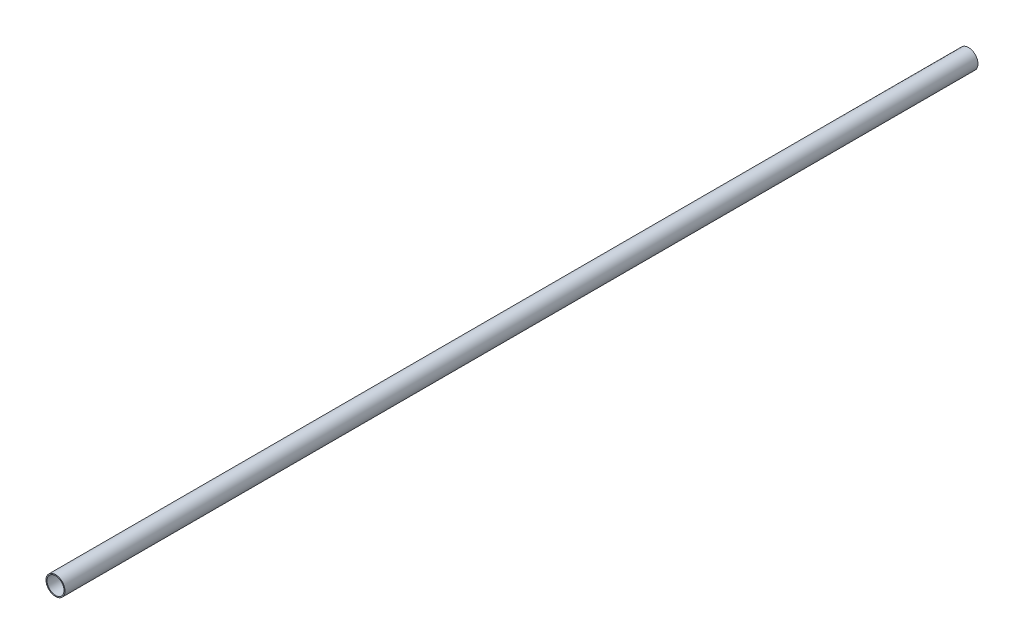
ISO-10303-21;
HEADER;
FILE_DESCRIPTION(('STEP AP214'),'2;1');
FILE_NAME('part.step','',(''),(''),'','','');
FILE_SCHEMA(('AUTOMOTIVE_DESIGN { 1 0 10303 214 1 1 1 1 }'));
ENDSEC;
DATA;
#1=APPLICATION_CONTEXT('core data for automotive mechanical design processes');
#2=APPLICATION_PROTOCOL_DEFINITION('international standard','automotive_design',2000,#1);
#3=PRODUCT_CONTEXT('',#1,'mechanical');
#4=PRODUCT('Part','Part','',(#3));
#5=PRODUCT_RELATED_PRODUCT_CATEGORY('part','',(#4));
#6=PRODUCT_DEFINITION_FORMATION('','',#4);
#7=PRODUCT_DEFINITION_CONTEXT('part definition',#1,'design');
#8=PRODUCT_DEFINITION('design','',#6,#7);
#9=PRODUCT_DEFINITION_SHAPE('','',#8);
#10=(LENGTH_UNIT() NAMED_UNIT(*) SI_UNIT(.MILLI.,.METRE.));
#11=(NAMED_UNIT(*) PLANE_ANGLE_UNIT() SI_UNIT($,.RADIAN.));
#12=(NAMED_UNIT(*) SI_UNIT($,.STERADIAN.) SOLID_ANGLE_UNIT());
#13=UNCERTAINTY_MEASURE_WITH_UNIT(LENGTH_MEASURE(1.E-05),#10,'distance_accuracy_value','');
#14=(GEOMETRIC_REPRESENTATION_CONTEXT(3) GLOBAL_UNCERTAINTY_ASSIGNED_CONTEXT((#13)) GLOBAL_UNIT_ASSIGNED_CONTEXT((#10,
#11,#12)) REPRESENTATION_CONTEXT('',''));
#15=CARTESIAN_POINT('',(0.,0.,0.));
#16=DIRECTION('',(0.,0.,1.));
#17=DIRECTION('',(1.,0.,0.));
#18=AXIS2_PLACEMENT_3D('',#15,#16,#17);
#19=CARTESIAN_POINT('',(0.,0.,5486.4));
#20=DIRECTION('',(0.,0.,1.));
#21=DIRECTION('',(1.,0.,0.));
#22=AXIS2_PLACEMENT_3D('',#19,#20,#21);
#23=PLANE('',#22);
#24=CARTESIAN_POINT('',(0.,0.,5486.4));
#25=DIRECTION('',(0.,0.,1.));
#26=DIRECTION('',(1.,0.,0.));
#27=AXIS2_PLACEMENT_3D('',#24,#25,#26);
#28=CIRCLE('',#27,57.15);
#29=CARTESIAN_POINT('',(57.15,0.,5486.4));
#30=VERTEX_POINT('',#29);
#31=EDGE_CURVE('E10',#30,#30,#28,.T.);
#32=ORIENTED_EDGE('',*,*,#31,.T.);
#33=EDGE_LOOP('',(#32));
#34=FACE_BOUND('',#33,.T.);
#35=CARTESIAN_POINT('',(0.,0.,5486.4));
#36=DIRECTION('',(0.,0.,1.));
#37=DIRECTION('',(1.,0.,0.));
#38=AXIS2_PLACEMENT_3D('',#35,#36,#37);
#39=CIRCLE('',#38,51.1302);
#40=CARTESIAN_POINT('',(51.1302,0.,5486.4));
#41=VERTEX_POINT('',#40);
#42=EDGE_CURVE('E47',#41,#41,#39,.T.);
#43=ORIENTED_EDGE('',*,*,#42,.F.);
#44=EDGE_LOOP('',(#43));
#45=FACE_BOUND('',#44,.T.);
#46=ADVANCED_FACE('F36',(#34,#45),#23,.T.);
#47=CARTESIAN_POINT('',(0.,0.,0.));
#48=DIRECTION('',(0.,0.,1.));
#49=DIRECTION('',(1.,0.,0.));
#50=AXIS2_PLACEMENT_3D('',#47,#48,#49);
#51=PLANE('',#50);
#52=CARTESIAN_POINT('',(0.,0.,0.));
#53=DIRECTION('',(0.,0.,1.));
#54=DIRECTION('',(1.,0.,0.));
#55=AXIS2_PLACEMENT_3D('',#52,#53,#54);
#56=CIRCLE('',#55,57.15);
#57=CARTESIAN_POINT('',(57.15,0.,0.));
#58=VERTEX_POINT('',#57);
#59=EDGE_CURVE('E40',#58,#58,#56,.T.);
#60=ORIENTED_EDGE('',*,*,#59,.F.);
#61=EDGE_LOOP('',(#60));
#62=FACE_BOUND('',#61,.T.);
#63=CARTESIAN_POINT('',(0.,0.,0.));
#64=DIRECTION('',(0.,0.,1.));
#65=DIRECTION('',(1.,0.,0.));
#66=AXIS2_PLACEMENT_3D('',#63,#64,#65);
#67=CIRCLE('',#66,51.1302);
#68=CARTESIAN_POINT('',(51.1302,0.,0.));
#69=VERTEX_POINT('',#68);
#70=EDGE_CURVE('E49',#69,#69,#67,.T.);
#71=ORIENTED_EDGE('',*,*,#70,.T.);
#72=EDGE_LOOP('',(#71));
#73=FACE_BOUND('',#72,.T.);
#74=ADVANCED_FACE('F59',(#62,#73),#51,.F.);
#75=CARTESIAN_POINT('',(0.,0.,5486.4));
#76=DIRECTION('',(0.,0.,-1.));
#77=DIRECTION('',(-1.,0.,0.));
#78=AXIS2_PLACEMENT_3D('',#75,#76,#77);
#79=CYLINDRICAL_SURFACE('',#78,57.15);
#80=ORIENTED_EDGE('',*,*,#31,.F.);
#81=EDGE_LOOP('',(#80));
#82=FACE_BOUND('',#81,.T.);
#83=ORIENTED_EDGE('',*,*,#59,.T.);
#84=EDGE_LOOP('',(#83));
#85=FACE_BOUND('',#84,.T.);
#86=ADVANCED_FACE('F38',(#82,#85),#79,.T.);
#87=CARTESIAN_POINT('',(0.,0.,5486.4));
#88=DIRECTION('',(0.,0.,-1.));
#89=DIRECTION('',(-1.,0.,0.));
#90=AXIS2_PLACEMENT_3D('',#87,#88,#89);
#91=CYLINDRICAL_SURFACE('',#90,51.1302);
#92=ORIENTED_EDGE('',*,*,#42,.T.);
#93=EDGE_LOOP('',(#92));
#94=FACE_BOUND('',#93,.T.);
#95=ORIENTED_EDGE('',*,*,#70,.F.);
#96=EDGE_LOOP('',(#95));
#97=FACE_BOUND('',#96,.T.);
#98=ADVANCED_FACE('F55',(#94,#97),#91,.F.);
#99=CLOSED_SHELL('',(#46,#74,#86,#98));
#100=MANIFOLD_SOLID_BREP('B2',#99);
#101=ADVANCED_BREP_SHAPE_REPRESENTATION('',(#18,#100),#14);
#102=SHAPE_DEFINITION_REPRESENTATION(#9,#101);
ENDSEC;
END-ISO-10303-21;
